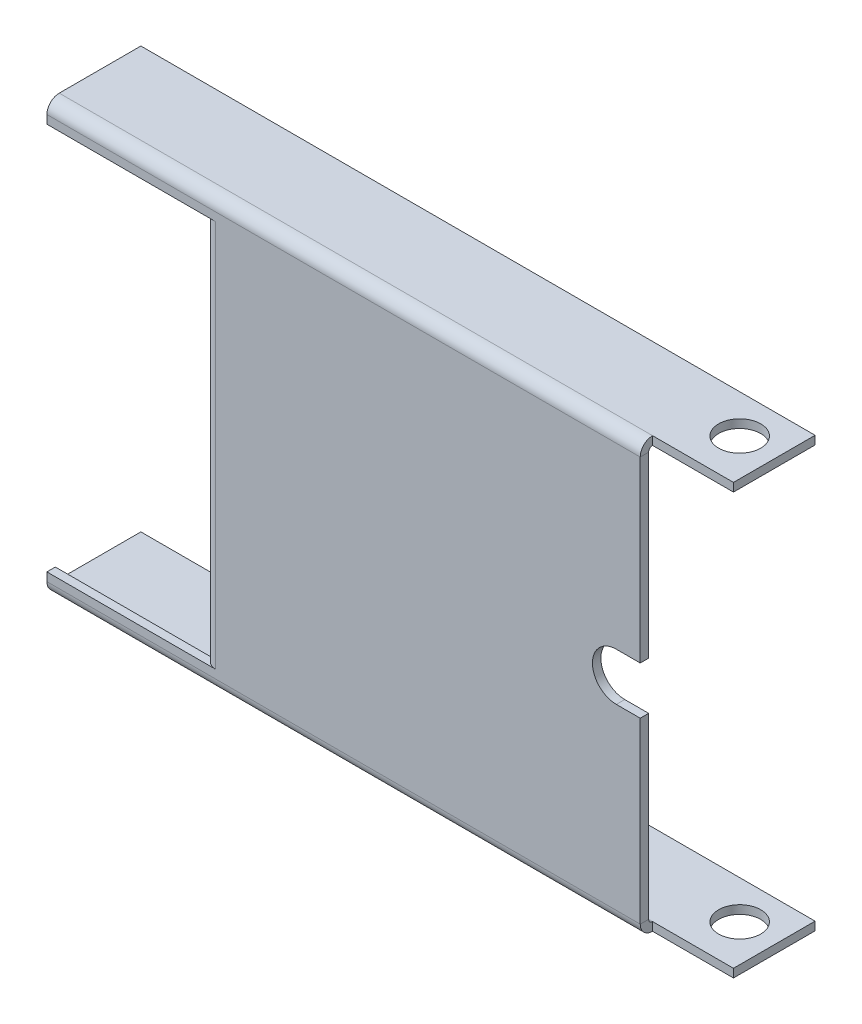
ISO-10303-21;
HEADER;
FILE_DESCRIPTION(('STEP AP214'),'2;1');
FILE_NAME('part.step','',(''),(''),'','','');
FILE_SCHEMA(('AUTOMOTIVE_DESIGN { 1 0 10303 214 1 1 1 1 }'));
ENDSEC;
DATA;
#1=APPLICATION_CONTEXT('core data for automotive mechanical design processes');
#2=APPLICATION_PROTOCOL_DEFINITION('international standard','automotive_design',2000,#1);
#3=PRODUCT_CONTEXT('',#1,'mechanical');
#4=PRODUCT('Part','Part','',(#3));
#5=PRODUCT_RELATED_PRODUCT_CATEGORY('part','',(#4));
#6=PRODUCT_DEFINITION_FORMATION('','',#4);
#7=PRODUCT_DEFINITION_CONTEXT('part definition',#1,'design');
#8=PRODUCT_DEFINITION('design','',#6,#7);
#9=PRODUCT_DEFINITION_SHAPE('','',#8);
#10=(LENGTH_UNIT() NAMED_UNIT(*) SI_UNIT(.MILLI.,.METRE.));
#11=(NAMED_UNIT(*) PLANE_ANGLE_UNIT() SI_UNIT($,.RADIAN.));
#12=(NAMED_UNIT(*) SI_UNIT($,.STERADIAN.) SOLID_ANGLE_UNIT());
#13=UNCERTAINTY_MEASURE_WITH_UNIT(LENGTH_MEASURE(1.E-05),#10,'distance_accuracy_value','');
#14=(GEOMETRIC_REPRESENTATION_CONTEXT(3) GLOBAL_UNCERTAINTY_ASSIGNED_CONTEXT((#13)) GLOBAL_UNIT_ASSIGNED_CONTEXT((#10,
#11,#12)) REPRESENTATION_CONTEXT('',''));
#15=CARTESIAN_POINT('',(0.,0.,0.));
#16=DIRECTION('',(0.,0.,1.));
#17=DIRECTION('',(1.,0.,0.));
#18=AXIS2_PLACEMENT_3D('',#15,#16,#17);
#19=CARTESIAN_POINT('',(-34.0741,0.,1.28592153515319E-13));
#20=DIRECTION('',(1.,0.,0.));
#21=DIRECTION('',(0.,0.,-1.));
#22=AXIS2_PLACEMENT_3D('',#19,#20,#21);
#23=PLANE('',#22);
#24=DIRECTION('',(0.,0.,1.));
#25=VECTOR('',#24,1.);
#26=CARTESIAN_POINT('',(-34.0741,-32.7025,1.28592153515319E-13));
#27=LINE('',#26,#25);
#28=CARTESIAN_POINT('',(-34.0741,-32.7025,-17.70126));
#29=VERTEX_POINT('',#28);
#30=CARTESIAN_POINT('',(-34.0741,-32.7025,-2.32409999999999));
#31=VERTEX_POINT('',#30);
#32=EDGE_CURVE('E13',#29,#31,#27,.T.);
#33=ORIENTED_EDGE('',*,*,#32,.F.);
#34=DIRECTION('',(0.,-1.,0.));
#35=VECTOR('',#34,1.);
#36=CARTESIAN_POINT('',(-34.0741,0.,-17.70126));
#37=LINE('',#36,#35);
#38=CARTESIAN_POINT('',(-34.0741,-36.5125,-17.70126));
#39=VERTEX_POINT('',#38);
#40=EDGE_CURVE('E257',#29,#39,#37,.T.);
#41=ORIENTED_EDGE('',*,*,#40,.T.);
#42=DIRECTION('',(0.,0.,1.));
#43=VECTOR('',#42,1.);
#44=CARTESIAN_POINT('',(-34.0741,-36.5125,1.28592153515319E-13));
#45=LINE('',#44,#43);
#46=CARTESIAN_POINT('',(-34.0741,-36.5125,-2.32409999999999));
#47=VERTEX_POINT('',#46);
#48=EDGE_CURVE('E260',#39,#47,#45,.T.);
#49=ORIENTED_EDGE('',*,*,#48,.T.);
#50=DIRECTION('',(0.,1.,0.));
#51=VECTOR('',#50,1.);
#52=CARTESIAN_POINT('',(-34.0741,-36.5125,-2.32409999999999));
#53=LINE('',#52,#51);
#54=EDGE_CURVE('E294',#31,#47,#53,.F.);
#55=ORIENTED_EDGE('',*,*,#54,.F.);
#56=EDGE_LOOP('',(#33,#41,#49,#55));
#57=FACE_BOUND('',#56,.T.);
#58=ADVANCED_FACE('F75',(#57),#23,.F.);
#59=DIRECTION('',(0.,0.,-1.));
#60=VECTOR('',#59,1.);
#61=CARTESIAN_POINT('',(-34.0741,32.7025,1.28592153515319E-13));
#62=LINE('',#61,#60);
#63=CARTESIAN_POINT('',(-34.0741,32.7025,-2.32409999999999));
#64=VERTEX_POINT('',#63);
#65=CARTESIAN_POINT('',(-34.0741,32.7025,-17.70126));
#66=VERTEX_POINT('',#65);
#67=EDGE_CURVE('E84',#64,#66,#62,.T.);
#68=ORIENTED_EDGE('',*,*,#67,.F.);
#69=CARTESIAN_POINT('',(-34.0741,36.5125,-2.32409999999999));
#70=VERTEX_POINT('',#69);
#71=EDGE_CURVE('E290',#70,#64,#53,.F.);
#72=ORIENTED_EDGE('',*,*,#71,.F.);
#73=DIRECTION('',(0.,0.,-1.));
#74=VECTOR('',#73,1.);
#75=CARTESIAN_POINT('',(-34.0741,36.5125,1.44315135840141E-13));
#76=LINE('',#75,#74);
#77=CARTESIAN_POINT('',(-34.0741,36.5125,-17.70126));
#78=VERTEX_POINT('',#77);
#79=EDGE_CURVE('E263',#70,#78,#76,.T.);
#80=ORIENTED_EDGE('',*,*,#79,.T.);
#81=EDGE_CURVE('E265',#78,#66,#37,.T.);
#82=ORIENTED_EDGE('',*,*,#81,.T.);
#83=EDGE_LOOP('',(#68,#72,#80,#82));
#84=FACE_BOUND('',#83,.T.);
#85=ADVANCED_FACE('F579',(#84),#23,.F.);
#86=CARTESIAN_POINT('',(-63.5,55.88,-1.5875));
#87=DIRECTION('',(-1.,0.,0.));
#88=DIRECTION('',(0.,-1.,0.));
#89=AXIS2_PLACEMENT_3D('',#86,#87,#88);
#90=PLANE('',#89);
#91=DIRECTION('',(0.,0.,-1.));
#92=VECTOR('',#91,1.);
#93=CARTESIAN_POINT('',(-63.5,36.5125,-1.5875));
#94=LINE('',#93,#92);
#95=CARTESIAN_POINT('',(-63.5,36.5125,0.));
#96=VERTEX_POINT('',#95);
#97=CARTESIAN_POINT('',(-63.5,36.5125,-1.5875));
#98=VERTEX_POINT('',#97);
#99=EDGE_CURVE('E504',#96,#98,#94,.T.);
#100=ORIENTED_EDGE('',*,*,#99,.F.);
#101=DIRECTION('',(0.,-1.,0.));
#102=VECTOR('',#101,1.);
#103=CARTESIAN_POINT('',(-63.5,55.88,0.));
#104=LINE('',#103,#102);
#105=CARTESIAN_POINT('',(-63.5,38.1,0.));
#106=VERTEX_POINT('',#105);
#107=EDGE_CURVE('E495',#106,#96,#104,.T.);
#108=ORIENTED_EDGE('',*,*,#107,.F.);
#109=DIRECTION('',(0.,0.,1.));
#110=VECTOR('',#109,1.);
#111=CARTESIAN_POINT('',(-63.5,38.1,-1.5875));
#112=LINE('',#111,#110);
#113=CARTESIAN_POINT('',(-63.5,38.1,-1.5875));
#114=VERTEX_POINT('',#113);
#115=EDGE_CURVE('E476',#114,#106,#112,.T.);
#116=ORIENTED_EDGE('',*,*,#115,.F.);
#117=DIRECTION('',(0.,-1.,0.));
#118=VECTOR('',#117,1.);
#119=CARTESIAN_POINT('',(-63.5,55.88,-1.5875));
#120=LINE('',#119,#118);
#121=EDGE_CURVE('E477',#114,#98,#120,.T.);
#122=ORIENTED_EDGE('',*,*,#121,.T.);
#123=EDGE_LOOP('',(#100,#108,#116,#122));
#124=FACE_BOUND('',#123,.T.);
#125=ADVANCED_FACE('F524',(#124),#90,.T.);
#126=CARTESIAN_POINT('',(0.,0.,-1.5875));
#127=DIRECTION('',(0.,0.,-1.));
#128=DIRECTION('',(-1.,0.,0.));
#129=AXIS2_PLACEMENT_3D('',#126,#127,#128);
#130=PLANE('',#129);
#131=DIRECTION('',(1.,0.,0.));
#132=VECTOR('',#131,1.);
#133=CARTESIAN_POINT('',(0.,36.5125,-1.5875));
#134=LINE('',#133,#132);
#135=CARTESIAN_POINT('',(-31.75,36.5125,-1.5875));
#136=VERTEX_POINT('',#135);
#137=EDGE_CURVE('E328',#98,#136,#134,.T.);
#138=ORIENTED_EDGE('',*,*,#137,.F.);
#139=ORIENTED_EDGE('',*,*,#121,.F.);
#140=DIRECTION('',(-1.,0.,0.));
#141=VECTOR('',#140,1.);
#142=CARTESIAN_POINT('',(0.,38.1,-1.5875));
#143=LINE('',#142,#141);
#144=CARTESIAN_POINT('',(48.26,38.1,-1.5875));
#145=VERTEX_POINT('',#144);
#146=EDGE_CURVE('E474',#145,#114,#143,.T.);
#147=ORIENTED_EDGE('',*,*,#146,.F.);
#148=DIRECTION('',(0.,1.,0.));
#149=VECTOR('',#148,1.);
#150=CARTESIAN_POINT('',(48.26,0.,-1.58749999999991));
#151=LINE('',#150,#149);
#152=CARTESIAN_POINT('',(48.26,4.5,-1.58749999999998));
#153=VERTEX_POINT('',#152);
#154=EDGE_CURVE('E375',#145,#153,#151,.F.);
#155=ORIENTED_EDGE('',*,*,#154,.T.);
#156=DIRECTION('',(-1.,0.,0.));
#157=VECTOR('',#156,1.);
#158=CARTESIAN_POINT('',(0.,4.5,-1.5875));
#159=LINE('',#158,#157);
#160=CARTESIAN_POINT('',(43.76,4.5,-1.5875));
#161=VERTEX_POINT('',#160);
#162=EDGE_CURVE('E347',#153,#161,#159,.T.);
#163=ORIENTED_EDGE('',*,*,#162,.T.);
#164=CARTESIAN_POINT('',(43.76,0.,-1.5875));
#165=DIRECTION('',(0.,0.,-1.));
#166=DIRECTION('',(-1.,0.,0.));
#167=AXIS2_PLACEMENT_3D('',#164,#165,#166);
#168=CIRCLE('',#167,4.5);
#169=CARTESIAN_POINT('',(43.76,-4.5,-1.5875));
#170=VERTEX_POINT('',#169);
#171=EDGE_CURVE('E350',#170,#161,#168,.T.);
#172=ORIENTED_EDGE('',*,*,#171,.F.);
#173=DIRECTION('',(-1.,0.,0.));
#174=VECTOR('',#173,1.);
#175=CARTESIAN_POINT('',(0.,-4.5,-1.5875));
#176=LINE('',#175,#174);
#177=CARTESIAN_POINT('',(48.26,-4.5,-1.58749999999998));
#178=VERTEX_POINT('',#177);
#179=EDGE_CURVE('E344',#178,#170,#176,.T.);
#180=ORIENTED_EDGE('',*,*,#179,.F.);
#181=CARTESIAN_POINT('',(48.26,-38.1,-1.5875));
#182=VERTEX_POINT('',#181);
#183=EDGE_CURVE('E374',#178,#182,#151,.F.);
#184=ORIENTED_EDGE('',*,*,#183,.T.);
#185=DIRECTION('',(-1.,0.,0.));
#186=VECTOR('',#185,1.);
#187=CARTESIAN_POINT('',(0.,-38.1,-1.5875));
#188=LINE('',#187,#186);
#189=CARTESIAN_POINT('',(-63.5,-38.1,-1.5875));
#190=VERTEX_POINT('',#189);
#191=EDGE_CURVE('E482',#182,#190,#188,.T.);
#192=ORIENTED_EDGE('',*,*,#191,.T.);
#193=CARTESIAN_POINT('',(-63.5,-36.5125,-1.5875));
#194=VERTEX_POINT('',#193);
#195=EDGE_CURVE('E494',#194,#190,#120,.T.);
#196=ORIENTED_EDGE('',*,*,#195,.F.);
#197=DIRECTION('',(-1.,0.,0.));
#198=VECTOR('',#197,1.);
#199=CARTESIAN_POINT('',(0.,-36.5125,-1.5875));
#200=LINE('',#199,#198);
#201=CARTESIAN_POINT('',(-31.75,-36.5125,-1.5875));
#202=VERTEX_POINT('',#201);
#203=EDGE_CURVE('E324',#202,#194,#200,.T.);
#204=ORIENTED_EDGE('',*,*,#203,.F.);
#205=DIRECTION('',(0.,-1.,0.));
#206=VECTOR('',#205,1.);
#207=CARTESIAN_POINT('',(-31.75,0.,-1.5875));
#208=LINE('',#207,#206);
#209=EDGE_CURVE('E330',#136,#202,#208,.T.);
#210=ORIENTED_EDGE('',*,*,#209,.F.);
#211=EDGE_LOOP('',(#138,#139,#147,#155,#163,#172,#180,#184,#192,#196,#204,#210));
#212=FACE_BOUND('',#211,.T.);
#213=ADVANCED_FACE('F519',(#212),#130,.T.);
#214=CARTESIAN_POINT('',(0.,0.,0.));
#215=DIRECTION('',(0.,0.,-1.));
#216=DIRECTION('',(-1.,0.,0.));
#217=AXIS2_PLACEMENT_3D('',#214,#215,#216);
#218=PLANE('',#217);
#219=ORIENTED_EDGE('',*,*,#107,.T.);
#220=DIRECTION('',(-1.,0.,0.));
#221=VECTOR('',#220,1.);
#222=CARTESIAN_POINT('',(-63.5,36.5125,0.));
#223=LINE('',#222,#221);
#224=CARTESIAN_POINT('',(-31.75,36.5125,0.));
#225=VERTEX_POINT('',#224);
#226=EDGE_CURVE('E318',#225,#96,#223,.T.);
#227=ORIENTED_EDGE('',*,*,#226,.F.);
#228=DIRECTION('',(0.,1.,0.));
#229=VECTOR('',#228,1.);
#230=CARTESIAN_POINT('',(-31.75,36.5125,0.));
#231=LINE('',#230,#229);
#232=CARTESIAN_POINT('',(-31.75,-36.5125,0.));
#233=VERTEX_POINT('',#232);
#234=EDGE_CURVE('E315',#233,#225,#231,.T.);
#235=ORIENTED_EDGE('',*,*,#234,.F.);
#236=DIRECTION('',(1.,0.,0.));
#237=VECTOR('',#236,1.);
#238=CARTESIAN_POINT('',(-63.5,-36.5125,0.));
#239=LINE('',#238,#237);
#240=CARTESIAN_POINT('',(-63.5,-36.5125,0.));
#241=VERTEX_POINT('',#240);
#242=EDGE_CURVE('E304',#241,#233,#239,.T.);
#243=ORIENTED_EDGE('',*,*,#242,.F.);
#244=CARTESIAN_POINT('',(-63.5,-38.1,0.));
#245=VERTEX_POINT('',#244);
#246=EDGE_CURVE('E471',#241,#245,#104,.T.);
#247=ORIENTED_EDGE('',*,*,#246,.T.);
#248=DIRECTION('',(-1.,0.,0.));
#249=VECTOR('',#248,1.);
#250=CARTESIAN_POINT('',(0.,-38.1,0.));
#251=LINE('',#250,#249);
#252=CARTESIAN_POINT('',(48.26,-38.1,0.));
#253=VERTEX_POINT('',#252);
#254=EDGE_CURVE('E485',#253,#245,#251,.T.);
#255=ORIENTED_EDGE('',*,*,#254,.F.);
#256=DIRECTION('',(0.,-1.,0.));
#257=VECTOR('',#256,1.);
#258=CARTESIAN_POINT('',(48.26,-38.8366000000001,0.));
#259=LINE('',#258,#257);
#260=CARTESIAN_POINT('',(48.26,-4.5,0.));
#261=VERTEX_POINT('',#260);
#262=EDGE_CURVE('E367',#261,#253,#259,.T.);
#263=ORIENTED_EDGE('',*,*,#262,.F.);
#264=DIRECTION('',(1.,0.,0.));
#265=VECTOR('',#264,1.);
#266=CARTESIAN_POINT('',(0.,-4.5,0.));
#267=LINE('',#266,#265);
#268=CARTESIAN_POINT('',(43.76,-4.5,0.));
#269=VERTEX_POINT('',#268);
#270=EDGE_CURVE('E336',#269,#261,#267,.T.);
#271=ORIENTED_EDGE('',*,*,#270,.F.);
#272=CARTESIAN_POINT('',(43.76,0.,0.));
#273=DIRECTION('',(0.,0.,1.));
#274=DIRECTION('',(1.,0.,0.));
#275=AXIS2_PLACEMENT_3D('',#272,#273,#274);
#276=CIRCLE('',#275,4.5);
#277=CARTESIAN_POINT('',(43.76,4.5,0.));
#278=VERTEX_POINT('',#277);
#279=EDGE_CURVE('E333',#278,#269,#276,.T.);
#280=ORIENTED_EDGE('',*,*,#279,.F.);
#281=DIRECTION('',(1.,0.,0.));
#282=VECTOR('',#281,1.);
#283=CARTESIAN_POINT('',(0.,4.5,0.));
#284=LINE('',#283,#282);
#285=CARTESIAN_POINT('',(48.26,4.5,0.));
#286=VERTEX_POINT('',#285);
#287=EDGE_CURVE('E338',#278,#286,#284,.T.);
#288=ORIENTED_EDGE('',*,*,#287,.T.);
#289=CARTESIAN_POINT('',(48.26,38.1,0.));
#290=VERTEX_POINT('',#289);
#291=EDGE_CURVE('E368',#290,#286,#259,.T.);
#292=ORIENTED_EDGE('',*,*,#291,.F.);
#293=DIRECTION('',(-1.,0.,0.));
#294=VECTOR('',#293,1.);
#295=CARTESIAN_POINT('',(0.,38.1,0.));
#296=LINE('',#295,#294);
#297=EDGE_CURVE('E480',#290,#106,#296,.T.);
#298=ORIENTED_EDGE('',*,*,#297,.T.);
#299=EDGE_LOOP('',(#219,#227,#235,#243,#247,#255,#263,#271,#280,#288,#292,#298));
#300=FACE_BOUND('',#299,.T.);
#301=ADVANCED_FACE('F618',(#300),#218,.F.);
#302=CARTESIAN_POINT('',(48.26,-38.8366000000001,0.));
#303=DIRECTION('',(1.,0.,0.));
#304=DIRECTION('',(0.,-1.,0.));
#305=AXIS2_PLACEMENT_3D('',#302,#303,#304);
#306=PLANE('',#305);
#307=ORIENTED_EDGE('',*,*,#291,.T.);
#308=DIRECTION('',(0.,0.,-1.));
#309=VECTOR('',#308,1.);
#310=CARTESIAN_POINT('',(48.26,4.5,0.));
#311=LINE('',#310,#309);
#312=EDGE_CURVE('E499',#286,#153,#311,.T.);
#313=ORIENTED_EDGE('',*,*,#312,.T.);
#314=ORIENTED_EDGE('',*,*,#154,.F.);
#315=DIRECTION('',(0.,0.,1.));
#316=VECTOR('',#315,1.);
#317=CARTESIAN_POINT('',(48.26,38.1,-1.58749999999991));
#318=LINE('',#317,#316);
#319=EDGE_CURVE('E364',#145,#290,#318,.T.);
#320=ORIENTED_EDGE('',*,*,#319,.T.);
#321=EDGE_LOOP('',(#307,#313,#314,#320));
#322=FACE_BOUND('',#321,.T.);
#323=ADVANCED_FACE('F536',(#322),#306,.T.);
#324=CARTESIAN_POINT('',(-127.032667996758,38.1,-2.3241));
#325=DIRECTION('',(1.,0.,0.));
#326=DIRECTION('',(0.,1.,0.));
#327=AXIS2_PLACEMENT_3D('',#324,#325,#326);
#328=CYLINDRICAL_SURFACE('',#327,0.7366);
#329=DIRECTION('',(-1.,0.,0.));
#330=VECTOR('',#329,1.);
#331=CARTESIAN_POINT('',(0.,38.8366,-2.3241));
#332=LINE('',#331,#330);
#333=CARTESIAN_POINT('',(48.26,38.8366,-2.3241));
#334=VERTEX_POINT('',#333);
#335=CARTESIAN_POINT('',(-63.5,38.8366,-2.3241));
#336=VERTEX_POINT('',#335);
#337=EDGE_CURVE('E460',#334,#336,#332,.T.);
#338=ORIENTED_EDGE('',*,*,#337,.F.);
#339=CARTESIAN_POINT('',(48.26,38.1,-2.3241));
#340=DIRECTION('',(1.,0.,0.));
#341=DIRECTION('',(0.,0.,-1.));
#342=AXIS2_PLACEMENT_3D('',#339,#340,#341);
#343=CIRCLE('',#342,0.736599999999998);
#344=EDGE_CURVE('E391',#334,#145,#343,.T.);
#345=ORIENTED_EDGE('',*,*,#344,.T.);
#346=ORIENTED_EDGE('',*,*,#146,.T.);
#347=CARTESIAN_POINT('',(-63.5,38.1,-2.3241));
#348=DIRECTION('',(-1.,0.,0.));
#349=DIRECTION('',(0.,0.,-1.));
#350=AXIS2_PLACEMENT_3D('',#347,#348,#349);
#351=CIRCLE('',#350,0.736599999999998);
#352=EDGE_CURVE('E468',#114,#336,#351,.T.);
#353=ORIENTED_EDGE('',*,*,#352,.T.);
#354=EDGE_LOOP('',(#338,#345,#346,#353));
#355=FACE_BOUND('',#354,.T.);
#356=ADVANCED_FACE('F532',(#355),#328,.F.);
#357=CARTESIAN_POINT('',(-127.032667996758,38.1,-2.3241));
#358=DIRECTION('',(1.,0.,0.));
#359=DIRECTION('',(0.,1.,0.));
#360=AXIS2_PLACEMENT_3D('',#357,#358,#359);
#361=CYLINDRICAL_SURFACE('',#360,2.3241);
#362=CARTESIAN_POINT('',(48.26,38.1,-2.3241));
#363=DIRECTION('',(-1.,0.,0.));
#364=DIRECTION('',(0.,-1.,0.));
#365=AXIS2_PLACEMENT_3D('',#362,#363,#364);
#366=CIRCLE('',#365,2.3241);
#367=CARTESIAN_POINT('',(48.26,40.4241,-2.32410000000001));
#368=VERTEX_POINT('',#367);
#369=EDGE_CURVE('E389',#368,#290,#366,.F.);
#370=ORIENTED_EDGE('',*,*,#369,.F.);
#371=DIRECTION('',(-1.,0.,0.));
#372=VECTOR('',#371,1.);
#373=CARTESIAN_POINT('',(0.,40.4241,-2.32410000000001));
#374=LINE('',#373,#372);
#375=CARTESIAN_POINT('',(-63.5,40.4241,-2.3241));
#376=VERTEX_POINT('',#375);
#377=EDGE_CURVE('E431',#368,#376,#374,.T.);
#378=ORIENTED_EDGE('',*,*,#377,.T.);
#379=CARTESIAN_POINT('',(-63.5,38.1,-2.3241));
#380=DIRECTION('',(1.,0.,0.));
#381=DIRECTION('',(0.,1.,0.));
#382=AXIS2_PLACEMENT_3D('',#379,#380,#381);
#383=CIRCLE('',#382,2.3241);
#384=EDGE_CURVE('E437',#106,#376,#383,.F.);
#385=ORIENTED_EDGE('',*,*,#384,.F.);
#386=ORIENTED_EDGE('',*,*,#297,.F.);
#387=EDGE_LOOP('',(#370,#378,#385,#386));
#388=FACE_BOUND('',#387,.T.);
#389=ADVANCED_FACE('F545',(#388),#361,.T.);
#390=CARTESIAN_POINT('',(127.032667996758,-38.1000000000001,-2.3241));
#391=DIRECTION('',(-1.,0.,0.));
#392=DIRECTION('',(0.,-1.,0.));
#393=AXIS2_PLACEMENT_3D('',#390,#391,#392);
#394=CYLINDRICAL_SURFACE('',#393,0.7366);
#395=ORIENTED_EDGE('',*,*,#191,.F.);
#396=CARTESIAN_POINT('',(48.26,-38.1,-2.32409999999997));
#397=DIRECTION('',(1.,0.,0.));
#398=DIRECTION('',(0.,1.,0.));
#399=AXIS2_PLACEMENT_3D('',#396,#397,#398);
#400=CIRCLE('',#399,0.7366);
#401=CARTESIAN_POINT('',(48.26,-38.8366000000001,-2.32409999999997));
#402=VERTEX_POINT('',#401);
#403=EDGE_CURVE('E383',#182,#402,#400,.T.);
#404=ORIENTED_EDGE('',*,*,#403,.T.);
#405=DIRECTION('',(-1.,0.,0.));
#406=VECTOR('',#405,1.);
#407=CARTESIAN_POINT('',(0.,-38.8366,-2.32409999999997));
#408=LINE('',#407,#406);
#409=CARTESIAN_POINT('',(-63.5,-38.8366,-2.3241));
#410=VERTEX_POINT('',#409);
#411=EDGE_CURVE('E394',#402,#410,#408,.T.);
#412=ORIENTED_EDGE('',*,*,#411,.T.);
#413=CARTESIAN_POINT('',(-63.5,-38.1,-2.3241));
#414=DIRECTION('',(-1.,0.,0.));
#415=DIRECTION('',(0.,0.,-1.));
#416=AXIS2_PLACEMENT_3D('',#413,#414,#415);
#417=CIRCLE('',#416,0.736599999999998);
#418=EDGE_CURVE('E428',#410,#190,#417,.T.);
#419=ORIENTED_EDGE('',*,*,#418,.T.);
#420=EDGE_LOOP('',(#395,#404,#412,#419));
#421=FACE_BOUND('',#420,.T.);
#422=ADVANCED_FACE('F666',(#421),#394,.F.);
#423=CARTESIAN_POINT('',(127.032667996758,-38.1000000000001,-2.3241));
#424=DIRECTION('',(-1.,0.,0.));
#425=DIRECTION('',(0.,-1.,0.));
#426=AXIS2_PLACEMENT_3D('',#423,#424,#425);
#427=CYLINDRICAL_SURFACE('',#426,2.3241);
#428=CARTESIAN_POINT('',(48.2600000000001,-38.1,-2.32409999999997));
#429=DIRECTION('',(-1.,0.,0.));
#430=DIRECTION('',(0.,-1.,0.));
#431=AXIS2_PLACEMENT_3D('',#428,#429,#430);
#432=CIRCLE('',#431,2.3241);
#433=CARTESIAN_POINT('',(48.26,-40.4241000000001,-2.32409999999998));
#434=VERTEX_POINT('',#433);
#435=EDGE_CURVE('E378',#253,#434,#432,.F.);
#436=ORIENTED_EDGE('',*,*,#435,.F.);
#437=ORIENTED_EDGE('',*,*,#254,.T.);
#438=CARTESIAN_POINT('',(-63.5,-38.1,-2.3241));
#439=DIRECTION('',(-1.,0.,0.));
#440=DIRECTION('',(0.,-1.,0.));
#441=AXIS2_PLACEMENT_3D('',#438,#439,#440);
#442=CIRCLE('',#441,2.3241);
#443=CARTESIAN_POINT('',(-63.5,-40.4241,-2.32409999999998));
#444=VERTEX_POINT('',#443);
#445=EDGE_CURVE('E398',#444,#245,#442,.T.);
#446=ORIENTED_EDGE('',*,*,#445,.F.);
#447=DIRECTION('',(-1.,0.,0.));
#448=VECTOR('',#447,1.);
#449=CARTESIAN_POINT('',(0.,-40.4241,-2.32409999999998));
#450=LINE('',#449,#448);
#451=EDGE_CURVE('E409',#434,#444,#450,.T.);
#452=ORIENTED_EDGE('',*,*,#451,.F.);
#453=EDGE_LOOP('',(#436,#437,#446,#452));
#454=FACE_BOUND('',#453,.T.);
#455=ADVANCED_FACE('F634',(#454),#427,.T.);
#456=DIRECTION('',(0.,0.,1.));
#457=VECTOR('',#456,1.);
#458=CARTESIAN_POINT('',(-63.5,-36.5125,-1.5875));
#459=LINE('',#458,#457);
#460=EDGE_CURVE('E502',#194,#241,#459,.T.);
#461=ORIENTED_EDGE('',*,*,#460,.F.);
#462=ORIENTED_EDGE('',*,*,#195,.T.);
#463=DIRECTION('',(0.,0.,1.));
#464=VECTOR('',#463,1.);
#465=CARTESIAN_POINT('',(-63.5,-38.1,-1.5875));
#466=LINE('',#465,#464);
#467=EDGE_CURVE('E488',#190,#245,#466,.T.);
#468=ORIENTED_EDGE('',*,*,#467,.T.);
#469=ORIENTED_EDGE('',*,*,#246,.F.);
#470=EDGE_LOOP('',(#461,#462,#468,#469));
#471=FACE_BOUND('',#470,.T.);
#472=ADVANCED_FACE('F77',(#471),#90,.T.);
#473=CARTESIAN_POINT('',(-63.5,38.1,-2.3241));
#474=DIRECTION('',(1.,0.,0.));
#475=DIRECTION('',(0.,0.,-1.));
#476=AXIS2_PLACEMENT_3D('',#473,#474,#475);
#477=PLANE('',#476);
#478=ORIENTED_EDGE('',*,*,#384,.T.);
#479=DIRECTION('',(0.,1.,0.));
#480=VECTOR('',#479,1.);
#481=CARTESIAN_POINT('',(-63.5,38.8366,-2.3241));
#482=LINE('',#481,#480);
#483=EDGE_CURVE('E451',#336,#376,#482,.T.);
#484=ORIENTED_EDGE('',*,*,#483,.F.);
#485=ORIENTED_EDGE('',*,*,#352,.F.);
#486=ORIENTED_EDGE('',*,*,#115,.T.);
#487=EDGE_LOOP('',(#478,#484,#485,#486));
#488=FACE_BOUND('',#487,.T.);
#489=ADVANCED_FACE('F529',(#488),#477,.F.);
#490=CARTESIAN_POINT('',(63.5,38.8365999999999,-17.7002318412894));
#491=DIRECTION('',(0.,0.,-1.));
#492=DIRECTION('',(-1.,0.,0.));
#493=AXIS2_PLACEMENT_3D('',#490,#491,#492);
#494=PLANE('',#493);
#495=DIRECTION('',(-1.,0.,0.));
#496=VECTOR('',#495,1.);
#497=CARTESIAN_POINT('',(63.5,40.4240999999999,-17.7002318412894));
#498=LINE('',#497,#496);
#499=CARTESIAN_POINT('',(63.5,40.4240999999999,-17.7002318412894));
#500=VERTEX_POINT('',#499);
#501=CARTESIAN_POINT('',(-63.5,40.4241,-17.7002318412894));
#502=VERTEX_POINT('',#501);
#503=EDGE_CURVE('E446',#500,#502,#498,.T.);
#504=ORIENTED_EDGE('',*,*,#503,.F.);
#505=DIRECTION('',(0.,1.,0.));
#506=VECTOR('',#505,1.);
#507=CARTESIAN_POINT('',(63.5,38.8365999999999,-17.7002318412894));
#508=LINE('',#507,#506);
#509=CARTESIAN_POINT('',(63.5,38.8365999999999,-17.7002318412894));
#510=VERTEX_POINT('',#509);
#511=EDGE_CURVE('E434',#510,#500,#508,.T.);
#512=ORIENTED_EDGE('',*,*,#511,.F.);
#513=DIRECTION('',(-1.,0.,0.));
#514=VECTOR('',#513,1.);
#515=CARTESIAN_POINT('',(63.5,38.8365999999999,-17.7002318412894));
#516=LINE('',#515,#514);
#517=CARTESIAN_POINT('',(-63.5,38.8366,-17.7002318412894));
#518=VERTEX_POINT('',#517);
#519=EDGE_CURVE('E463',#510,#518,#516,.T.);
#520=ORIENTED_EDGE('',*,*,#519,.T.);
#521=DIRECTION('',(0.,1.,0.));
#522=VECTOR('',#521,1.);
#523=CARTESIAN_POINT('',(-63.5,38.8366,-17.7002318412894));
#524=LINE('',#523,#522);
#525=EDGE_CURVE('E461',#518,#502,#524,.T.);
#526=ORIENTED_EDGE('',*,*,#525,.T.);
#527=EDGE_LOOP('',(#504,#512,#520,#526));
#528=FACE_BOUND('',#527,.T.);
#529=ADVANCED_FACE('F560',(#528),#494,.T.);
#530=CARTESIAN_POINT('',(0.,38.8366000000001,38.1797681587106));
#531=DIRECTION('',(0.,-1.,0.));
#532=DIRECTION('',(-1.,0.,0.));
#533=AXIS2_PLACEMENT_3D('',#530,#531,#532);
#534=PLANE('',#533);
#535=CARTESIAN_POINT('',(56.515,38.8366,-10.4775000000001));
#536=DIRECTION('',(0.,-1.,0.));
#537=DIRECTION('',(0.,0.,-1.));
#538=AXIS2_PLACEMENT_3D('',#535,#536,#537);
#539=CIRCLE('',#538,3.96875);
#540=CARTESIAN_POINT('',(56.515,38.8366,-14.4462500000001));
#541=VERTEX_POINT('',#540);
#542=EDGE_CURVE('E361',#541,#541,#539,.T.);
#543=ORIENTED_EDGE('',*,*,#542,.F.);
#544=EDGE_LOOP('',(#543));
#545=FACE_BOUND('',#544,.T.);
#546=DIRECTION('',(0.,0.,-1.));
#547=VECTOR('',#546,1.);
#548=CARTESIAN_POINT('',(63.5,38.8365999999999,-17.7002318412894));
#549=LINE('',#548,#547);
#550=CARTESIAN_POINT('',(63.5,38.8366,-2.3241));
#551=VERTEX_POINT('',#550);
#552=EDGE_CURVE('E438',#551,#510,#549,.T.);
#553=ORIENTED_EDGE('',*,*,#552,.F.);
#554=EDGE_CURVE('E457',#551,#334,#332,.T.);
#555=ORIENTED_EDGE('',*,*,#554,.T.);
#556=ORIENTED_EDGE('',*,*,#337,.T.);
#557=DIRECTION('',(0.,0.,1.));
#558=VECTOR('',#557,1.);
#559=CARTESIAN_POINT('',(-63.5,38.8366,-17.7002318412894));
#560=LINE('',#559,#558);
#561=EDGE_CURVE('E454',#518,#336,#560,.T.);
#562=ORIENTED_EDGE('',*,*,#561,.F.);
#563=ORIENTED_EDGE('',*,*,#519,.F.);
#564=EDGE_LOOP('',(#553,#555,#556,#562,#563));
#565=FACE_BOUND('',#564,.T.);
#566=ADVANCED_FACE('F557',(#545,#565),#534,.T.);
#567=CARTESIAN_POINT('',(-63.5,38.8366,-17.7002318412894));
#568=DIRECTION('',(-1.,0.,0.));
#569=DIRECTION('',(0.,0.,1.));
#570=AXIS2_PLACEMENT_3D('',#567,#568,#569);
#571=PLANE('',#570);
#572=ORIENTED_EDGE('',*,*,#561,.T.);
#573=ORIENTED_EDGE('',*,*,#483,.T.);
#574=DIRECTION('',(0.,0.,1.));
#575=VECTOR('',#574,1.);
#576=CARTESIAN_POINT('',(-63.5,40.4241,-17.7002318412894));
#577=LINE('',#576,#575);
#578=EDGE_CURVE('E443',#502,#376,#577,.T.);
#579=ORIENTED_EDGE('',*,*,#578,.F.);
#580=ORIENTED_EDGE('',*,*,#525,.F.);
#581=EDGE_LOOP('',(#572,#573,#579,#580));
#582=FACE_BOUND('',#581,.T.);
#583=ADVANCED_FACE('F552',(#582),#571,.T.);
#584=CARTESIAN_POINT('',(0.,40.4241000000001,38.1797681587106));
#585=DIRECTION('',(0.,-1.,0.));
#586=DIRECTION('',(-1.,0.,0.));
#587=AXIS2_PLACEMENT_3D('',#584,#585,#586);
#588=PLANE('',#587);
#589=CARTESIAN_POINT('',(56.515,40.4241,-10.4775000000001));
#590=DIRECTION('',(0.,1.,0.));
#591=DIRECTION('',(0.,0.,1.));
#592=AXIS2_PLACEMENT_3D('',#589,#590,#591);
#593=CIRCLE('',#592,3.96875);
#594=CARTESIAN_POINT('',(56.515,40.4241,-6.50875000000006));
#595=VERTEX_POINT('',#594);
#596=EDGE_CURVE('E352',#595,#595,#593,.T.);
#597=ORIENTED_EDGE('',*,*,#596,.F.);
#598=EDGE_LOOP('',(#597));
#599=FACE_BOUND('',#598,.T.);
#600=CARTESIAN_POINT('',(63.5,40.4241,-2.32410000000002));
#601=VERTEX_POINT('',#600);
#602=EDGE_CURVE('E466',#601,#368,#374,.T.);
#603=ORIENTED_EDGE('',*,*,#602,.F.);
#604=DIRECTION('',(0.,0.,-1.));
#605=VECTOR('',#604,1.);
#606=CARTESIAN_POINT('',(63.5,40.4240999999999,-17.7002318412894));
#607=LINE('',#606,#605);
#608=EDGE_CURVE('E449',#601,#500,#607,.T.);
#609=ORIENTED_EDGE('',*,*,#608,.T.);
#610=ORIENTED_EDGE('',*,*,#503,.T.);
#611=ORIENTED_EDGE('',*,*,#578,.T.);
#612=ORIENTED_EDGE('',*,*,#377,.F.);
#613=EDGE_LOOP('',(#603,#609,#610,#611,#612));
#614=FACE_BOUND('',#613,.T.);
#615=ADVANCED_FACE('F548',(#599,#614),#588,.F.);
#616=CARTESIAN_POINT('',(63.5,38.8365999999999,-17.7002318412894));
#617=DIRECTION('',(1.,0.,0.));
#618=DIRECTION('',(0.,0.,-1.));
#619=AXIS2_PLACEMENT_3D('',#616,#617,#618);
#620=PLANE('',#619);
#621=ORIENTED_EDGE('',*,*,#608,.F.);
#622=DIRECTION('',(0.,-1.,0.));
#623=VECTOR('',#622,1.);
#624=CARTESIAN_POINT('',(63.5,38.8366,-2.3241));
#625=LINE('',#624,#623);
#626=EDGE_CURVE('E440',#601,#551,#625,.T.);
#627=ORIENTED_EDGE('',*,*,#626,.T.);
#628=ORIENTED_EDGE('',*,*,#552,.T.);
#629=ORIENTED_EDGE('',*,*,#511,.T.);
#630=EDGE_LOOP('',(#621,#627,#628,#629));
#631=FACE_BOUND('',#630,.T.);
#632=ADVANCED_FACE('F563',(#631),#620,.T.);
#633=CARTESIAN_POINT('',(-63.5,-38.1,-2.3241));
#634=DIRECTION('',(1.,0.,0.));
#635=DIRECTION('',(0.,0.,-1.));
#636=AXIS2_PLACEMENT_3D('',#633,#634,#635);
#637=PLANE('',#636);
#638=DIRECTION('',(0.,-1.,0.));
#639=VECTOR('',#638,1.);
#640=CARTESIAN_POINT('',(-63.5,-38.8366,-2.32409999999997));
#641=LINE('',#640,#639);
#642=EDGE_CURVE('E423',#410,#444,#641,.T.);
#643=ORIENTED_EDGE('',*,*,#642,.T.);
#644=ORIENTED_EDGE('',*,*,#445,.T.);
#645=ORIENTED_EDGE('',*,*,#467,.F.);
#646=ORIENTED_EDGE('',*,*,#418,.F.);
#647=EDGE_LOOP('',(#643,#644,#645,#646));
#648=FACE_BOUND('',#647,.T.);
#649=ADVANCED_FACE('F637',(#648),#637,.F.);
#650=CARTESIAN_POINT('',(63.5,-38.8366,-17.7002318412893));
#651=DIRECTION('',(0.,0.,-1.));
#652=DIRECTION('',(1.,0.,0.));
#653=AXIS2_PLACEMENT_3D('',#650,#651,#652);
#654=PLANE('',#653);
#655=DIRECTION('',(1.,0.,0.));
#656=VECTOR('',#655,1.);
#657=CARTESIAN_POINT('',(63.5,-40.4241,-17.7002318412894));
#658=LINE('',#657,#656);
#659=CARTESIAN_POINT('',(-63.5,-40.4240999999999,-17.7002318412894));
#660=VERTEX_POINT('',#659);
#661=CARTESIAN_POINT('',(63.5,-40.4241,-17.7002318412894));
#662=VERTEX_POINT('',#661);
#663=EDGE_CURVE('E401',#660,#662,#658,.T.);
#664=ORIENTED_EDGE('',*,*,#663,.F.);
#665=DIRECTION('',(0.,-1.,0.));
#666=VECTOR('',#665,1.);
#667=CARTESIAN_POINT('',(-63.5,-38.8365999999999,-17.7002318412894));
#668=LINE('',#667,#666);
#669=CARTESIAN_POINT('',(-63.5,-38.8365999999999,-17.7002318412894));
#670=VERTEX_POINT('',#669);
#671=EDGE_CURVE('E395',#670,#660,#668,.T.);
#672=ORIENTED_EDGE('',*,*,#671,.F.);
#673=DIRECTION('',(1.,0.,0.));
#674=VECTOR('',#673,1.);
#675=CARTESIAN_POINT('',(63.5,-38.8366,-17.7002318412893));
#676=LINE('',#675,#674);
#677=CARTESIAN_POINT('',(63.5,-38.8366,-17.7002318412893));
#678=VERTEX_POINT('',#677);
#679=EDGE_CURVE('E418',#670,#678,#676,.T.);
#680=ORIENTED_EDGE('',*,*,#679,.T.);
#681=DIRECTION('',(0.,-1.,0.));
#682=VECTOR('',#681,1.);
#683=CARTESIAN_POINT('',(63.5,-38.8366,-17.7002318412893));
#684=LINE('',#683,#682);
#685=EDGE_CURVE('E416',#678,#662,#684,.T.);
#686=ORIENTED_EDGE('',*,*,#685,.T.);
#687=EDGE_LOOP('',(#664,#672,#680,#686));
#688=FACE_BOUND('',#687,.T.);
#689=ADVANCED_FACE('F652',(#688),#654,.T.);
#690=CARTESIAN_POINT('',(0.,-38.8366000000002,38.1797681587106));
#691=DIRECTION('',(0.,1.,0.));
#692=DIRECTION('',(-1.,0.,0.));
#693=AXIS2_PLACEMENT_3D('',#690,#691,#692);
#694=PLANE('',#693);
#695=CARTESIAN_POINT('',(56.515,-38.8366,-10.4774999999998));
#696=DIRECTION('',(0.,1.,0.));
#697=DIRECTION('',(0.,0.,1.));
#698=AXIS2_PLACEMENT_3D('',#695,#696,#697);
#699=CIRCLE('',#698,3.96875);
#700=CARTESIAN_POINT('',(56.515,-38.8366,-6.50874999999978));
#701=VERTEX_POINT('',#700);
#702=EDGE_CURVE('E358',#701,#701,#699,.T.);
#703=ORIENTED_EDGE('',*,*,#702,.F.);
#704=EDGE_LOOP('',(#703));
#705=FACE_BOUND('',#704,.T.);
#706=CARTESIAN_POINT('',(63.5,-38.8366000000001,-2.32409999999992));
#707=VERTEX_POINT('',#706);
#708=EDGE_CURVE('E426',#707,#402,#408,.T.);
#709=ORIENTED_EDGE('',*,*,#708,.F.);
#710=DIRECTION('',(0.,0.,1.));
#711=VECTOR('',#710,1.);
#712=CARTESIAN_POINT('',(63.5,-38.8366000000004,94.0597681587106));
#713=LINE('',#712,#711);
#714=EDGE_CURVE('E413',#678,#707,#713,.T.);
#715=ORIENTED_EDGE('',*,*,#714,.F.);
#716=ORIENTED_EDGE('',*,*,#679,.F.);
#717=DIRECTION('',(0.,0.,-1.));
#718=VECTOR('',#717,1.);
#719=CARTESIAN_POINT('',(-63.5,-38.8366000000003,94.0597681587106));
#720=LINE('',#719,#718);
#721=EDGE_CURVE('E399',#410,#670,#720,.T.);
#722=ORIENTED_EDGE('',*,*,#721,.F.);
#723=ORIENTED_EDGE('',*,*,#411,.F.);
#724=EDGE_LOOP('',(#709,#715,#716,#722,#723));
#725=FACE_BOUND('',#724,.T.);
#726=ADVANCED_FACE('F648',(#705,#725),#694,.T.);
#727=CARTESIAN_POINT('',(63.5,-38.8366000000004,94.0597681587106));
#728=DIRECTION('',(1.,0.,0.));
#729=DIRECTION('',(0.,0.,1.));
#730=AXIS2_PLACEMENT_3D('',#727,#728,#729);
#731=PLANE('',#730);
#732=DIRECTION('',(0.,1.,0.));
#733=VECTOR('',#732,1.);
#734=CARTESIAN_POINT('',(63.5,-38.8366000000001,-2.32409999999997));
#735=LINE('',#734,#733);
#736=CARTESIAN_POINT('',(63.5,-40.4241000000001,-2.32409999999995));
#737=VERTEX_POINT('',#736);
#738=EDGE_CURVE('E421',#737,#707,#735,.T.);
#739=ORIENTED_EDGE('',*,*,#738,.F.);
#740=DIRECTION('',(0.,0.,1.));
#741=VECTOR('',#740,1.);
#742=CARTESIAN_POINT('',(63.5,-40.4241000000004,94.0597681587106));
#743=LINE('',#742,#741);
#744=EDGE_CURVE('E410',#662,#737,#743,.T.);
#745=ORIENTED_EDGE('',*,*,#744,.F.);
#746=ORIENTED_EDGE('',*,*,#685,.F.);
#747=ORIENTED_EDGE('',*,*,#714,.T.);
#748=EDGE_LOOP('',(#739,#745,#746,#747));
#749=FACE_BOUND('',#748,.T.);
#750=ADVANCED_FACE('F741',(#749),#731,.T.);
#751=CARTESIAN_POINT('',(0.,-40.4241000000002,38.1797681587106));
#752=DIRECTION('',(0.,1.,0.));
#753=DIRECTION('',(-1.,0.,0.));
#754=AXIS2_PLACEMENT_3D('',#751,#752,#753);
#755=PLANE('',#754);
#756=CARTESIAN_POINT('',(56.515,-40.4241,-10.4774999999998));
#757=DIRECTION('',(0.,1.,0.));
#758=DIRECTION('',(0.,0.,1.));
#759=AXIS2_PLACEMENT_3D('',#756,#757,#758);
#760=CIRCLE('',#759,3.96875);
#761=CARTESIAN_POINT('',(56.515,-40.4241,-6.50874999999977));
#762=VERTEX_POINT('',#761);
#763=EDGE_CURVE('E355',#762,#762,#760,.F.);
#764=ORIENTED_EDGE('',*,*,#763,.F.);
#765=EDGE_LOOP('',(#764));
#766=FACE_BOUND('',#765,.T.);
#767=ORIENTED_EDGE('',*,*,#744,.T.);
#768=EDGE_CURVE('E406',#737,#434,#450,.T.);
#769=ORIENTED_EDGE('',*,*,#768,.T.);
#770=ORIENTED_EDGE('',*,*,#451,.T.);
#771=DIRECTION('',(0.,0.,-1.));
#772=VECTOR('',#771,1.);
#773=CARTESIAN_POINT('',(-63.5,-40.4241000000003,94.0597681587106));
#774=LINE('',#773,#772);
#775=EDGE_CURVE('E404',#444,#660,#774,.T.);
#776=ORIENTED_EDGE('',*,*,#775,.T.);
#777=ORIENTED_EDGE('',*,*,#663,.T.);
#778=EDGE_LOOP('',(#767,#769,#770,#776,#777));
#779=FACE_BOUND('',#778,.T.);
#780=ADVANCED_FACE('F655',(#766,#779),#755,.F.);
#781=CARTESIAN_POINT('',(-63.5,-38.8366000000003,94.0597681587106));
#782=DIRECTION('',(-1.,0.,0.));
#783=DIRECTION('',(0.,0.,-1.));
#784=AXIS2_PLACEMENT_3D('',#781,#782,#783);
#785=PLANE('',#784);
#786=ORIENTED_EDGE('',*,*,#642,.F.);
#787=ORIENTED_EDGE('',*,*,#721,.T.);
#788=ORIENTED_EDGE('',*,*,#671,.T.);
#789=ORIENTED_EDGE('',*,*,#775,.F.);
#790=EDGE_LOOP('',(#786,#787,#788,#789));
#791=FACE_BOUND('',#790,.T.);
#792=ADVANCED_FACE('F576',(#791),#785,.T.);
#793=CARTESIAN_POINT('',(48.26,38.1,-2.3241));
#794=DIRECTION('',(-1.,0.,0.));
#795=DIRECTION('',(0.,0.,1.));
#796=AXIS2_PLACEMENT_3D('',#793,#794,#795);
#797=PLANE('',#796);
#798=DIRECTION('',(0.,1.,0.));
#799=VECTOR('',#798,1.);
#800=CARTESIAN_POINT('',(48.26,38.8366000000001,-2.32410000000001));
#801=LINE('',#800,#799);
#802=EDGE_CURVE('E386',#334,#368,#801,.T.);
#803=ORIENTED_EDGE('',*,*,#802,.T.);
#804=ORIENTED_EDGE('',*,*,#369,.T.);
#805=ORIENTED_EDGE('',*,*,#319,.F.);
#806=ORIENTED_EDGE('',*,*,#344,.F.);
#807=EDGE_LOOP('',(#803,#804,#805,#806));
#808=FACE_BOUND('',#807,.T.);
#809=ADVANCED_FACE('F539',(#808),#797,.F.);
#810=CARTESIAN_POINT('',(55.88,38.8366,-2.3241));
#811=DIRECTION('',(0.,0.,-1.));
#812=DIRECTION('',(-1.,0.,0.));
#813=AXIS2_PLACEMENT_3D('',#810,#811,#812);
#814=PLANE('',#813);
#815=ORIENTED_EDGE('',*,*,#802,.F.);
#816=ORIENTED_EDGE('',*,*,#554,.F.);
#817=ORIENTED_EDGE('',*,*,#626,.F.);
#818=ORIENTED_EDGE('',*,*,#602,.T.);
#819=EDGE_LOOP('',(#815,#816,#817,#818));
#820=FACE_BOUND('',#819,.T.);
#821=ADVANCED_FACE('F565',(#820),#814,.F.);
#822=CARTESIAN_POINT('',(55.88,-38.8366000000002,-2.32409999999995));
#823=DIRECTION('',(0.,0.,1.));
#824=DIRECTION('',(-1.,0.,0.));
#825=AXIS2_PLACEMENT_3D('',#822,#823,#824);
#826=PLANE('',#825);
#827=ORIENTED_EDGE('',*,*,#738,.T.);
#828=ORIENTED_EDGE('',*,*,#708,.T.);
#829=DIRECTION('',(0.,-1.,1.00089258388556E-13));
#830=VECTOR('',#829,1.);
#831=CARTESIAN_POINT('',(48.26,-38.8366000000002,-2.32409999999991));
#832=LINE('',#831,#830);
#833=EDGE_CURVE('E381',#402,#434,#832,.T.);
#834=ORIENTED_EDGE('',*,*,#833,.T.);
#835=ORIENTED_EDGE('',*,*,#768,.F.);
#836=EDGE_LOOP('',(#827,#828,#834,#835));
#837=FACE_BOUND('',#836,.T.);
#838=ADVANCED_FACE('F567',(#837),#826,.T.);
#839=CARTESIAN_POINT('',(48.26,-38.1,-2.32409999999997));
#840=DIRECTION('',(-1.,0.,0.));
#841=DIRECTION('',(0.,-1.,0.));
#842=AXIS2_PLACEMENT_3D('',#839,#840,#841);
#843=PLANE('',#842);
#844=DIRECTION('',(0.,0.,1.));
#845=VECTOR('',#844,1.);
#846=CARTESIAN_POINT('',(48.26,-38.1,-1.58749999999991));
#847=LINE('',#846,#845);
#848=EDGE_CURVE('E371',#182,#253,#847,.T.);
#849=ORIENTED_EDGE('',*,*,#848,.T.);
#850=ORIENTED_EDGE('',*,*,#435,.T.);
#851=ORIENTED_EDGE('',*,*,#833,.F.);
#852=ORIENTED_EDGE('',*,*,#403,.F.);
#853=EDGE_LOOP('',(#849,#850,#851,#852));
#854=FACE_BOUND('',#853,.T.);
#855=ADVANCED_FACE('F573',(#854),#843,.F.);
#856=DIRECTION('',(0.,0.,-1.));
#857=VECTOR('',#856,1.);
#858=CARTESIAN_POINT('',(48.26,-4.5,0.));
#859=LINE('',#858,#857);
#860=EDGE_CURVE('E491',#261,#178,#859,.T.);
#861=ORIENTED_EDGE('',*,*,#860,.F.);
#862=ORIENTED_EDGE('',*,*,#262,.T.);
#863=ORIENTED_EDGE('',*,*,#848,.F.);
#864=ORIENTED_EDGE('',*,*,#183,.F.);
#865=EDGE_LOOP('',(#861,#862,#863,#864));
#866=FACE_BOUND('',#865,.T.);
#867=ADVANCED_FACE('F664',(#866),#306,.T.);
#868=CARTESIAN_POINT('',(56.515,-51.6494201513365,-10.4774999999997));
#869=DIRECTION('',(0.,1.,0.));
#870=DIRECTION('',(0.,0.,1.));
#871=AXIS2_PLACEMENT_3D('',#868,#869,#870);
#872=CYLINDRICAL_SURFACE('',#871,3.96875);
#873=ORIENTED_EDGE('',*,*,#702,.T.);
#874=EDGE_LOOP('',(#873));
#875=FACE_BOUND('',#874,.T.);
#876=ORIENTED_EDGE('',*,*,#763,.T.);
#877=EDGE_LOOP('',(#876));
#878=FACE_BOUND('',#877,.T.);
#879=ADVANCED_FACE('F709',(#875,#878),#872,.F.);
#880=ORIENTED_EDGE('',*,*,#542,.T.);
#881=EDGE_LOOP('',(#880));
#882=FACE_BOUND('',#881,.T.);
#883=ORIENTED_EDGE('',*,*,#596,.T.);
#884=EDGE_LOOP('',(#883));
#885=FACE_BOUND('',#884,.T.);
#886=ADVANCED_FACE('F714',(#882,#885),#872,.F.);
#887=CARTESIAN_POINT('',(43.76,0.,-17.7002318412894));
#888=DIRECTION('',(0.,0.,1.));
#889=DIRECTION('',(1.,0.,0.));
#890=AXIS2_PLACEMENT_3D('',#887,#888,#889);
#891=CYLINDRICAL_SURFACE('',#890,4.5);
#892=ORIENTED_EDGE('',*,*,#171,.T.);
#893=DIRECTION('',(0.,0.,1.));
#894=VECTOR('',#893,1.);
#895=CARTESIAN_POINT('',(43.76,4.5,-17.7002318412894));
#896=LINE('',#895,#894);
#897=EDGE_CURVE('E342',#161,#278,#896,.T.);
#898=ORIENTED_EDGE('',*,*,#897,.T.);
#899=ORIENTED_EDGE('',*,*,#279,.T.);
#900=DIRECTION('',(0.,0.,1.));
#901=VECTOR('',#900,1.);
#902=CARTESIAN_POINT('',(43.76,-4.5,-17.7002318412894));
#903=LINE('',#902,#901);
#904=EDGE_CURVE('E341',#170,#269,#903,.T.);
#905=ORIENTED_EDGE('',*,*,#904,.F.);
#906=EDGE_LOOP('',(#892,#898,#899,#905));
#907=FACE_BOUND('',#906,.T.);
#908=ADVANCED_FACE('F763',(#907),#891,.F.);
#909=CARTESIAN_POINT('',(0.,4.5,-17.7002318412894));
#910=DIRECTION('',(0.,-1.,0.));
#911=DIRECTION('',(0.,0.,-1.));
#912=AXIS2_PLACEMENT_3D('',#909,#910,#911);
#913=PLANE('',#912);
#914=ORIENTED_EDGE('',*,*,#312,.F.);
#915=ORIENTED_EDGE('',*,*,#287,.F.);
#916=ORIENTED_EDGE('',*,*,#897,.F.);
#917=ORIENTED_EDGE('',*,*,#162,.F.);
#918=EDGE_LOOP('',(#914,#915,#916,#917));
#919=FACE_BOUND('',#918,.T.);
#920=ADVANCED_FACE('F791',(#919),#913,.T.);
#921=CARTESIAN_POINT('',(0.,-4.5,-17.7002318412894));
#922=DIRECTION('',(0.,-1.,0.));
#923=DIRECTION('',(0.,0.,-1.));
#924=AXIS2_PLACEMENT_3D('',#921,#922,#923);
#925=PLANE('',#924);
#926=ORIENTED_EDGE('',*,*,#179,.T.);
#927=ORIENTED_EDGE('',*,*,#904,.T.);
#928=ORIENTED_EDGE('',*,*,#270,.T.);
#929=ORIENTED_EDGE('',*,*,#860,.T.);
#930=EDGE_LOOP('',(#926,#927,#928,#929));
#931=FACE_BOUND('',#930,.T.);
#932=ADVANCED_FACE('F802',(#931),#925,.F.);
#933=CARTESIAN_POINT('',(-63.5,36.5125,-2.54));
#934=DIRECTION('',(0.,1.,0.));
#935=DIRECTION('',(-1.,0.,0.));
#936=AXIS2_PLACEMENT_3D('',#933,#934,#935);
#937=PLANE('',#936);
#938=ORIENTED_EDGE('',*,*,#137,.T.);
#939=DIRECTION('',(0.,0.,1.));
#940=VECTOR('',#939,1.);
#941=CARTESIAN_POINT('',(-31.75,36.5125,-2.54));
#942=LINE('',#941,#940);
#943=EDGE_CURVE('E321',#136,#225,#942,.T.);
#944=ORIENTED_EDGE('',*,*,#943,.T.);
#945=ORIENTED_EDGE('',*,*,#226,.T.);
#946=ORIENTED_EDGE('',*,*,#99,.T.);
#947=EDGE_LOOP('',(#938,#944,#945,#946));
#948=FACE_BOUND('',#947,.T.);
#949=ADVANCED_FACE('F513',(#948),#937,.F.);
#950=CARTESIAN_POINT('',(-63.5,-36.5125,-2.54));
#951=DIRECTION('',(0.,-1.,0.));
#952=DIRECTION('',(1.,0.,0.));
#953=AXIS2_PLACEMENT_3D('',#950,#951,#952);
#954=PLANE('',#953);
#955=ORIENTED_EDGE('',*,*,#203,.T.);
#956=ORIENTED_EDGE('',*,*,#460,.T.);
#957=ORIENTED_EDGE('',*,*,#242,.T.);
#958=DIRECTION('',(0.,0.,1.));
#959=VECTOR('',#958,1.);
#960=CARTESIAN_POINT('',(-31.75,-36.5125,-2.54));
#961=LINE('',#960,#959);
#962=EDGE_CURVE('E320',#202,#233,#961,.T.);
#963=ORIENTED_EDGE('',*,*,#962,.F.);
#964=EDGE_LOOP('',(#955,#956,#957,#963));
#965=FACE_BOUND('',#964,.T.);
#966=ADVANCED_FACE('F623',(#965),#954,.F.);
#967=CARTESIAN_POINT('',(-31.75,-36.5125,-2.3241));
#968=DIRECTION('',(0.,-1.,0.));
#969=DIRECTION('',(0.,0.,-1.));
#970=AXIS2_PLACEMENT_3D('',#967,#968,#969);
#971=PLANE('',#970);
#972=DIRECTION('',(1.,0.,0.));
#973=VECTOR('',#972,1.);
#974=CARTESIAN_POINT('',(-34.0741,-36.5125,-2.32409999999999));
#975=LINE('',#974,#973);
#976=CARTESIAN_POINT('',(-32.4866,-36.5125,-2.3241));
#977=VERTEX_POINT('',#976);
#978=EDGE_CURVE('E279',#977,#47,#975,.F.);
#979=ORIENTED_EDGE('',*,*,#978,.F.);
#980=CARTESIAN_POINT('',(-31.75,-36.5125,-2.3241));
#981=DIRECTION('',(0.,1.,0.));
#982=DIRECTION('',(0.,0.,1.));
#983=AXIS2_PLACEMENT_3D('',#980,#981,#982);
#984=CIRCLE('',#983,0.73659999999999);
#985=EDGE_CURVE('E308',#202,#977,#984,.F.);
#986=ORIENTED_EDGE('',*,*,#985,.F.);
#987=ORIENTED_EDGE('',*,*,#962,.T.);
#988=CARTESIAN_POINT('',(-31.75,-36.5125,-2.3241));
#989=DIRECTION('',(0.,1.,0.));
#990=DIRECTION('',(0.,0.,1.));
#991=AXIS2_PLACEMENT_3D('',#988,#989,#990);
#992=CIRCLE('',#991,2.32409999999999);
#993=EDGE_CURVE('E301',#233,#47,#992,.F.);
#994=ORIENTED_EDGE('',*,*,#993,.T.);
#995=EDGE_LOOP('',(#979,#986,#987,#994));
#996=FACE_BOUND('',#995,.T.);
#997=ADVANCED_FACE('F621',(#996),#971,.T.);
#998=CARTESIAN_POINT('',(-31.75,36.5125,-2.3241));
#999=DIRECTION('',(0.,-1.,0.));
#1000=DIRECTION('',(0.,0.,-1.));
#1001=AXIS2_PLACEMENT_3D('',#998,#999,#1000);
#1002=PLANE('',#1001);
#1003=CARTESIAN_POINT('',(-31.75,36.5125,-2.3241));
#1004=DIRECTION('',(0.,1.,0.));
#1005=DIRECTION('',(0.,0.,1.));
#1006=AXIS2_PLACEMENT_3D('',#1003,#1004,#1005);
#1007=CIRCLE('',#1006,0.73659999999999);
#1008=CARTESIAN_POINT('',(-32.4866,36.5125,-2.3241));
#1009=VERTEX_POINT('',#1008);
#1010=EDGE_CURVE('E311',#1009,#136,#1007,.T.);
#1011=ORIENTED_EDGE('',*,*,#1010,.F.);
#1012=DIRECTION('',(1.,0.,0.));
#1013=VECTOR('',#1012,1.);
#1014=CARTESIAN_POINT('',(-32.4866,36.5125,-2.3241));
#1015=LINE('',#1014,#1013);
#1016=EDGE_CURVE('E295',#1009,#70,#1015,.F.);
#1017=ORIENTED_EDGE('',*,*,#1016,.T.);
#1018=CARTESIAN_POINT('',(-31.75,36.5125,-2.3241));
#1019=DIRECTION('',(0.,1.,0.));
#1020=DIRECTION('',(0.,0.,1.));
#1021=AXIS2_PLACEMENT_3D('',#1018,#1019,#1020);
#1022=CIRCLE('',#1021,2.32409999999999);
#1023=EDGE_CURVE('E305',#70,#225,#1022,.T.);
#1024=ORIENTED_EDGE('',*,*,#1023,.T.);
#1025=ORIENTED_EDGE('',*,*,#943,.F.);
#1026=EDGE_LOOP('',(#1011,#1017,#1024,#1025));
#1027=FACE_BOUND('',#1026,.T.);
#1028=ADVANCED_FACE('F611',(#1027),#1002,.F.);
#1029=CARTESIAN_POINT('',(-31.75,36.5125,-2.3241));
#1030=DIRECTION('',(0.,1.,0.));
#1031=DIRECTION('',(-1.,0.,0.));
#1032=AXIS2_PLACEMENT_3D('',#1029,#1030,#1031);
#1033=CYLINDRICAL_SURFACE('',#1032,2.32409999999999);
#1034=ORIENTED_EDGE('',*,*,#234,.T.);
#1035=ORIENTED_EDGE('',*,*,#1023,.F.);
#1036=ORIENTED_EDGE('',*,*,#71,.T.);
#1037=EDGE_CURVE('E293',#64,#31,#53,.F.);
#1038=ORIENTED_EDGE('',*,*,#1037,.T.);
#1039=ORIENTED_EDGE('',*,*,#54,.T.);
#1040=ORIENTED_EDGE('',*,*,#993,.F.);
#1041=EDGE_LOOP('',(#1034,#1035,#1036,#1038,#1039,#1040));
#1042=FACE_BOUND('',#1041,.T.);
#1043=ADVANCED_FACE('F615',(#1042),#1033,.T.);
#1044=CARTESIAN_POINT('',(-31.75,36.5125,-2.3241));
#1045=DIRECTION('',(0.,1.,0.));
#1046=DIRECTION('',(-1.,0.,0.));
#1047=AXIS2_PLACEMENT_3D('',#1044,#1045,#1046);
#1048=CYLINDRICAL_SURFACE('',#1047,0.73659999999999);
#1049=ORIENTED_EDGE('',*,*,#209,.T.);
#1050=ORIENTED_EDGE('',*,*,#985,.T.);
#1051=DIRECTION('',(0.,1.,0.));
#1052=VECTOR('',#1051,1.);
#1053=CARTESIAN_POINT('',(-32.4866,-36.5125,-2.3241));
#1054=LINE('',#1053,#1052);
#1055=EDGE_CURVE('E298',#977,#1009,#1054,.T.);
#1056=ORIENTED_EDGE('',*,*,#1055,.T.);
#1057=ORIENTED_EDGE('',*,*,#1010,.T.);
#1058=EDGE_LOOP('',(#1049,#1050,#1056,#1057));
#1059=FACE_BOUND('',#1058,.T.);
#1060=ADVANCED_FACE('F608',(#1059),#1048,.F.);
#1061=CARTESIAN_POINT('',(-34.0741,36.5125,-17.70126));
#1062=DIRECTION('',(0.,-1.,0.));
#1063=DIRECTION('',(0.,0.,-1.));
#1064=AXIS2_PLACEMENT_3D('',#1061,#1062,#1063);
#1065=PLANE('',#1064);
#1066=ORIENTED_EDGE('',*,*,#1016,.F.);
#1067=DIRECTION('',(0.,0.,1.));
#1068=VECTOR('',#1067,1.);
#1069=CARTESIAN_POINT('',(-32.4866,36.5125,-17.70126));
#1070=LINE('',#1069,#1068);
#1071=CARTESIAN_POINT('',(-32.4866,36.5125,-17.70126));
#1072=VERTEX_POINT('',#1071);
#1073=EDGE_CURVE('E288',#1009,#1072,#1070,.F.);
#1074=ORIENTED_EDGE('',*,*,#1073,.T.);
#1075=DIRECTION('',(1.,0.,0.));
#1076=VECTOR('',#1075,1.);
#1077=CARTESIAN_POINT('',(-34.0741,36.5125,-17.70126));
#1078=LINE('',#1077,#1076);
#1079=EDGE_CURVE('E275',#78,#1072,#1078,.T.);
#1080=ORIENTED_EDGE('',*,*,#1079,.F.);
#1081=ORIENTED_EDGE('',*,*,#79,.F.);
#1082=EDGE_LOOP('',(#1066,#1074,#1080,#1081));
#1083=FACE_BOUND('',#1082,.T.);
#1084=ADVANCED_FACE('F596',(#1083),#1065,.F.);
#1085=CARTESIAN_POINT('',(-34.0741,-36.5125,-1.58749999999999));
#1086=DIRECTION('',(0.,1.,0.));
#1087=DIRECTION('',(-1.,0.,0.));
#1088=AXIS2_PLACEMENT_3D('',#1085,#1086,#1087);
#1089=PLANE('',#1088);
#1090=ORIENTED_EDGE('',*,*,#978,.T.);
#1091=ORIENTED_EDGE('',*,*,#48,.F.);
#1092=DIRECTION('',(1.,0.,0.));
#1093=VECTOR('',#1092,1.);
#1094=CARTESIAN_POINT('',(-34.0741,-36.5125,-17.70126));
#1095=LINE('',#1094,#1093);
#1096=CARTESIAN_POINT('',(-32.4866,-36.5125,-17.70126));
#1097=VERTEX_POINT('',#1096);
#1098=EDGE_CURVE('E267',#39,#1097,#1095,.T.);
#1099=ORIENTED_EDGE('',*,*,#1098,.T.);
#1100=DIRECTION('',(0.,0.,-1.));
#1101=VECTOR('',#1100,1.);
#1102=CARTESIAN_POINT('',(-32.4866,-36.5125,-1.5875));
#1103=LINE('',#1102,#1101);
#1104=EDGE_CURVE('E285',#1097,#977,#1103,.F.);
#1105=ORIENTED_EDGE('',*,*,#1104,.T.);
#1106=EDGE_LOOP('',(#1090,#1091,#1099,#1105));
#1107=FACE_BOUND('',#1106,.T.);
#1108=ADVANCED_FACE('F278',(#1107),#1089,.F.);
#1109=EDGE_CURVE('E262',#66,#29,#37,.T.);
#1110=ORIENTED_EDGE('',*,*,#1109,.T.);
#1111=ORIENTED_EDGE('',*,*,#32,.T.);
#1112=ORIENTED_EDGE('',*,*,#1037,.F.);
#1113=ORIENTED_EDGE('',*,*,#67,.T.);
#1114=EDGE_LOOP('',(#1110,#1111,#1112,#1113));
#1115=FACE_BOUND('',#1114,.T.);
#1116=ADVANCED_FACE('F581',(#1115),#23,.F.);
#1117=CARTESIAN_POINT('',(-32.4866,0.,1.23049426889906E-13));
#1118=DIRECTION('',(1.,0.,0.));
#1119=DIRECTION('',(0.,0.,-1.));
#1120=AXIS2_PLACEMENT_3D('',#1117,#1118,#1119);
#1121=PLANE('',#1120);
#1122=ORIENTED_EDGE('',*,*,#1073,.F.);
#1123=ORIENTED_EDGE('',*,*,#1055,.F.);
#1124=ORIENTED_EDGE('',*,*,#1104,.F.);
#1125=DIRECTION('',(0.,1.,0.));
#1126=VECTOR('',#1125,1.);
#1127=CARTESIAN_POINT('',(-32.4866,-36.5125,-17.70126));
#1128=LINE('',#1127,#1126);
#1129=EDGE_CURVE('E271',#1072,#1097,#1128,.F.);
#1130=ORIENTED_EDGE('',*,*,#1129,.F.);
#1131=EDGE_LOOP('',(#1122,#1123,#1124,#1130));
#1132=FACE_BOUND('',#1131,.T.);
#1133=ADVANCED_FACE('F589',(#1132),#1121,.T.);
#1134=CARTESIAN_POINT('',(-34.0741,-36.5125,-17.70126));
#1135=DIRECTION('',(0.,0.,1.));
#1136=DIRECTION('',(1.,0.,0.));
#1137=AXIS2_PLACEMENT_3D('',#1134,#1135,#1136);
#1138=PLANE('',#1137);
#1139=ORIENTED_EDGE('',*,*,#1129,.T.);
#1140=ORIENTED_EDGE('',*,*,#1098,.F.);
#1141=ORIENTED_EDGE('',*,*,#40,.F.);
#1142=ORIENTED_EDGE('',*,*,#1109,.F.);
#1143=ORIENTED_EDGE('',*,*,#81,.F.);
#1144=ORIENTED_EDGE('',*,*,#1079,.T.);
#1145=EDGE_LOOP('',(#1139,#1140,#1141,#1142,#1143,#1144));
#1146=FACE_BOUND('',#1145,.T.);
#1147=ADVANCED_FACE('F268',(#1146),#1138,.F.);
#1148=CLOSED_SHELL('',(#58,#85,#125,#213,#301,#323,#356,#389,#422,#455,#472,#489,#529,#566,#583,
#615,#632,#649,#689,#726,#750,#780,#792,#809,#821,#838,#855,#867,#879,#886,#908,#920,#932,#949,
#966,#997,#1028,#1043,#1060,#1084,#1108,#1116,#1133,#1147));
#1149=MANIFOLD_SOLID_BREP('B2',#1148);
#1150=ADVANCED_BREP_SHAPE_REPRESENTATION('',(#18,#1149),#14);
#1151=SHAPE_DEFINITION_REPRESENTATION(#9,#1150);
ENDSEC;
END-ISO-10303-21;
